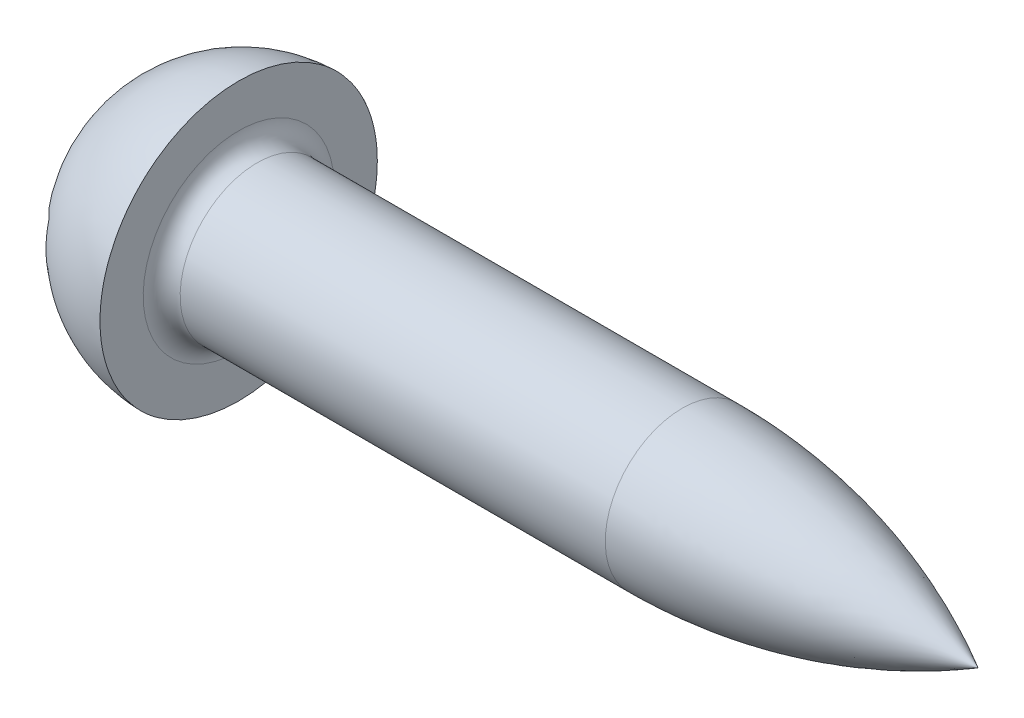
ISO-10303-21;
HEADER;
FILE_DESCRIPTION(('STEP AP214'),'2;1');
FILE_NAME('part.step','',(''),(''),'','','');
FILE_SCHEMA(('AUTOMOTIVE_DESIGN { 1 0 10303 214 1 1 1 1 }'));
ENDSEC;
DATA;
#1=APPLICATION_CONTEXT('core data for automotive mechanical design processes');
#2=APPLICATION_PROTOCOL_DEFINITION('international standard','automotive_design',2000,#1);
#3=PRODUCT_CONTEXT('',#1,'mechanical');
#4=PRODUCT('Part','Part','',(#3));
#5=PRODUCT_RELATED_PRODUCT_CATEGORY('part','',(#4));
#6=PRODUCT_DEFINITION_FORMATION('','',#4);
#7=PRODUCT_DEFINITION_CONTEXT('part definition',#1,'design');
#8=PRODUCT_DEFINITION('design','',#6,#7);
#9=PRODUCT_DEFINITION_SHAPE('','',#8);
#10=(LENGTH_UNIT() NAMED_UNIT(*) SI_UNIT(.MILLI.,.METRE.));
#11=(NAMED_UNIT(*) PLANE_ANGLE_UNIT() SI_UNIT($,.RADIAN.));
#12=(NAMED_UNIT(*) SI_UNIT($,.STERADIAN.) SOLID_ANGLE_UNIT());
#13=UNCERTAINTY_MEASURE_WITH_UNIT(LENGTH_MEASURE(1.E-05),#10,'distance_accuracy_value','');
#14=(GEOMETRIC_REPRESENTATION_CONTEXT(3) GLOBAL_UNCERTAINTY_ASSIGNED_CONTEXT((#13)) GLOBAL_UNIT_ASSIGNED_CONTEXT((#10,
#11,#12)) REPRESENTATION_CONTEXT('',''));
#15=CARTESIAN_POINT('',(0.,0.,0.));
#16=DIRECTION('',(0.,0.,1.));
#17=DIRECTION('',(1.,0.,0.));
#18=AXIS2_PLACEMENT_3D('',#15,#16,#17);
#19=CARTESIAN_POINT('',(3.75,0.,0.));
#20=DIRECTION('',(1.,0.,0.));
#21=DIRECTION('',(0.,1.,0.));
#22=AXIS2_PLACEMENT_3D('',#19,#20,#21);
#23=CYLINDRICAL_SURFACE('',#22,1.25);
#24=CARTESIAN_POINT('',(7.2,0.,0.));
#25=DIRECTION('',(1.,0.,0.));
#26=DIRECTION('',(0.,0.,-1.));
#27=AXIS2_PLACEMENT_3D('',#24,#25,#26);
#28=CIRCLE('',#27,1.25);
#29=CARTESIAN_POINT('',(7.2,0.,-1.25));
#30=VERTEX_POINT('',#29);
#31=EDGE_CURVE('E11',#30,#30,#28,.T.);
#32=ORIENTED_EDGE('',*,*,#31,.F.);
#33=EDGE_LOOP('',(#32));
#34=FACE_BOUND('',#33,.T.);
#35=CARTESIAN_POINT('',(0.3,0.,0.));
#36=DIRECTION('',(-1.,0.,0.));
#37=DIRECTION('',(0.,0.,-1.));
#38=AXIS2_PLACEMENT_3D('',#35,#36,#37);
#39=CIRCLE('',#38,1.25);
#40=CARTESIAN_POINT('',(0.3,0.,-1.25));
#41=VERTEX_POINT('',#40);
#42=EDGE_CURVE('E27',#41,#41,#39,.T.);
#43=ORIENTED_EDGE('',*,*,#42,.F.);
#44=EDGE_LOOP('',(#43));
#45=FACE_BOUND('',#44,.T.);
#46=ADVANCED_FACE('F17',(#34,#45),#23,.T.);
#47=CARTESIAN_POINT('',(7.1999999999987,-8.59099999998623,0.));
#48=DIRECTION('',(0.,0.,-1.));
#49=DIRECTION('',(0.,1.,0.));
#50=AXIS2_PLACEMENT_3D('',#47,#48,#49);
#51=CIRCLE('',#50,9.84099999998766);
#52=TRIMMED_CURVE('',#51,(PARAMETER_VALUE(-0.509516604872413)),
(PARAMETER_VALUE(0.509516604872413)),.T.,.PARAMETER.);
#53=CARTESIAN_POINT('',(7.19999999999872,0.,0.));
#54=DIRECTION('',(1.,0.,0.));
#55=AXIS1_PLACEMENT('',#53,#54);
#56=SURFACE_OF_REVOLUTION('',#52,#55);
#57=ORIENTED_EDGE('',*,*,#31,.T.);
#58=EDGE_LOOP('',(#57));
#59=FACE_BOUND('',#58,.T.);
#60=CARTESIAN_POINT('',(12.,0.,0.));
#61=VERTEX_POINT('',#60);
#62=VERTEX_LOOP('',#61);
#63=FACE_BOUND('',#62,.T.);
#64=ADVANCED_FACE('F19',(#59,#63),#56,.T.);
#65=CARTESIAN_POINT('',(0.3,0.,0.));
#66=DIRECTION('',(-1.,0.,0.));
#67=DIRECTION('',(0.,0.,1.));
#68=AXIS2_PLACEMENT_3D('',#65,#66,#67);
#69=TOROIDAL_SURFACE('',#68,1.55,0.3);
#70=ORIENTED_EDGE('',*,*,#42,.T.);
#71=EDGE_LOOP('',(#70));
#72=FACE_BOUND('',#71,.T.);
#73=CARTESIAN_POINT('',(0.,0.,0.));
#74=DIRECTION('',(-1.,0.,0.));
#75=DIRECTION('',(0.,-1.,0.));
#76=AXIS2_PLACEMENT_3D('',#73,#74,#75);
#77=CIRCLE('',#76,1.55);
#78=CARTESIAN_POINT('',(0.,-1.55,0.));
#79=VERTEX_POINT('',#78);
#80=EDGE_CURVE('E68',#79,#79,#77,.T.);
#81=ORIENTED_EDGE('',*,*,#80,.F.);
#82=EDGE_LOOP('',(#81));
#83=FACE_BOUND('',#82,.T.);
#84=ADVANCED_FACE('F74',(#72,#83),#69,.F.);
#85=CARTESIAN_POINT('',(0.,1.9,0.));
#86=DIRECTION('',(1.,0.,0.));
#87=DIRECTION('',(0.,-1.,0.));
#88=AXIS2_PLACEMENT_3D('',#85,#86,#87);
#89=PLANE('',#88);
#90=CARTESIAN_POINT('',(0.,0.,0.));
#91=DIRECTION('',(-1.,0.,0.));
#92=DIRECTION('',(0.,0.,1.));
#93=AXIS2_PLACEMENT_3D('',#90,#91,#92);
#94=CIRCLE('',#93,2.25);
#95=CARTESIAN_POINT('',(0.,0.,2.25));
#96=VERTEX_POINT('',#95);
#97=EDGE_CURVE('E64',#96,#96,#94,.T.);
#98=ORIENTED_EDGE('',*,*,#97,.F.);
#99=EDGE_LOOP('',(#98));
#100=FACE_BOUND('',#99,.T.);
#101=ORIENTED_EDGE('',*,*,#80,.T.);
#102=EDGE_LOOP('',(#101));
#103=FACE_BOUND('',#102,.T.);
#104=ADVANCED_FACE('F89',(#100,#103),#89,.T.);
#105=CARTESIAN_POINT('',(0.05056818181819,0.,0.));
#106=DIRECTION('',(0.,0.,1.));
#107=DIRECTION('',(1.,0.,0.));
#108=AXIS2_PLACEMENT_3D('',#105,#106,#107);
#109=SPHERICAL_SURFACE('',#108,2.250568181818);
#110=ORIENTED_EDGE('',*,*,#97,.T.);
#111=EDGE_LOOP('',(#110));
#112=FACE_BOUND('',#111,.T.);
#113=CARTESIAN_POINT('',(-1.45,0.,0.));
#114=DIRECTION('',(-1.,0.,0.));
#115=DIRECTION('',(0.,0.,1.));
#116=AXIS2_PLACEMENT_3D('',#113,#114,#115);
#117=CIRCLE('',#116,1.677305062512);
#118=CARTESIAN_POINT('',(-1.45,-0.4,1.628911376572));
#119=VERTEX_POINT('',#118);
#120=CARTESIAN_POINT('',(-1.45,0.4,1.628911376572));
#121=VERTEX_POINT('',#120);
#122=EDGE_CURVE('E43',#119,#121,#117,.T.);
#123=ORIENTED_EDGE('',*,*,#122,.F.);
#124=CARTESIAN_POINT('',(0.05056818181819,-0.4,0.));
#125=DIRECTION('',(0.,1.,0.));
#126=DIRECTION('',(-0.677538062508705,0.,-0.735487711557406));
#127=AXIS2_PLACEMENT_3D('',#124,#125,#126);
#128=CIRCLE('',#127,2.214736359256);
#129=CARTESIAN_POINT('',(-1.45,-0.4,-1.628911376572));
#130=VERTEX_POINT('',#129);
#131=EDGE_CURVE('E56',#130,#119,#128,.T.);
#132=ORIENTED_EDGE('',*,*,#131,.F.);
#133=CARTESIAN_POINT('',(-1.45,0.,0.));
#134=DIRECTION('',(-1.,0.,0.));
#135=DIRECTION('',(0.,0.23847778733881,-0.971147952140139));
#136=AXIS2_PLACEMENT_3D('',#133,#134,#135);
#137=CIRCLE('',#136,1.677305062512);
#138=CARTESIAN_POINT('',(-1.45,0.4,-1.628911376572));
#139=VERTEX_POINT('',#138);
#140=EDGE_CURVE('E50',#139,#130,#137,.T.);
#141=ORIENTED_EDGE('',*,*,#140,.F.);
#142=CARTESIAN_POINT('',(0.05056818181819,0.4,0.));
#143=DIRECTION('',(0.,-1.,0.));
#144=DIRECTION('',(-0.677538062508705,0.,0.735487711557406));
#145=AXIS2_PLACEMENT_3D('',#142,#143,#144);
#146=CIRCLE('',#145,2.214736359256);
#147=EDGE_CURVE('E61',#121,#139,#146,.T.);
#148=ORIENTED_EDGE('',*,*,#147,.F.);
#149=EDGE_LOOP('',(#123,#132,#141,#148));
#150=FACE_BOUND('',#149,.T.);
#151=ADVANCED_FACE('F57',(#112,#150),#109,.T.);
#152=CARTESIAN_POINT('',(-1.45,0.,0.));
#153=DIRECTION('',(1.,0.,0.));
#154=DIRECTION('',(0.,0.,-1.));
#155=AXIS2_PLACEMENT_3D('',#152,#153,#154);
#156=PLANE('',#155);
#157=DIRECTION('',(0.,0.,-1.));
#158=VECTOR('',#157,1.);
#159=CARTESIAN_POINT('',(-1.45,-0.4,1.628911376572));
#160=LINE('',#159,#158);
#161=EDGE_CURVE('E53',#119,#130,#160,.T.);
#162=ORIENTED_EDGE('',*,*,#161,.F.);
#163=ORIENTED_EDGE('',*,*,#122,.T.);
#164=DIRECTION('',(0.,0.,1.));
#165=VECTOR('',#164,1.);
#166=CARTESIAN_POINT('',(-1.45,0.4,-1.628911376572));
#167=LINE('',#166,#165);
#168=EDGE_CURVE('E21',#139,#121,#167,.T.);
#169=ORIENTED_EDGE('',*,*,#168,.F.);
#170=ORIENTED_EDGE('',*,*,#140,.T.);
#171=EDGE_LOOP('',(#162,#163,#169,#170));
#172=FACE_BOUND('',#171,.T.);
#173=ADVANCED_FACE('F51',(#172),#156,.F.);
#174=CARTESIAN_POINT('',(-2.2,0.4,3.25));
#175=DIRECTION('',(0.,1.,0.));
#176=DIRECTION('',(0.,0.,1.));
#177=AXIS2_PLACEMENT_3D('',#174,#175,#176);
#178=PLANE('',#177);
#179=ORIENTED_EDGE('',*,*,#168,.T.);
#180=ORIENTED_EDGE('',*,*,#147,.T.);
#181=EDGE_LOOP('',(#179,#180));
#182=FACE_BOUND('',#181,.T.);
#183=ADVANCED_FACE('F98',(#182),#178,.F.);
#184=CARTESIAN_POINT('',(-2.2,-0.4,-3.25));
#185=DIRECTION('',(0.,-1.,0.));
#186=DIRECTION('',(0.,0.,-1.));
#187=AXIS2_PLACEMENT_3D('',#184,#185,#186);
#188=PLANE('',#187);
#189=ORIENTED_EDGE('',*,*,#161,.T.);
#190=ORIENTED_EDGE('',*,*,#131,.T.);
#191=EDGE_LOOP('',(#189,#190));
#192=FACE_BOUND('',#191,.T.);
#193=ADVANCED_FACE('F60',(#192),#188,.F.);
#194=CLOSED_SHELL('',(#46,#64,#84,#104,#151,#173,#183,#193));
#195=MANIFOLD_SOLID_BREP('B1',#194);
#196=ADVANCED_BREP_SHAPE_REPRESENTATION('',(#18,#195),#14);
#197=SHAPE_DEFINITION_REPRESENTATION(#9,#196);
ENDSEC;
END-ISO-10303-21;
